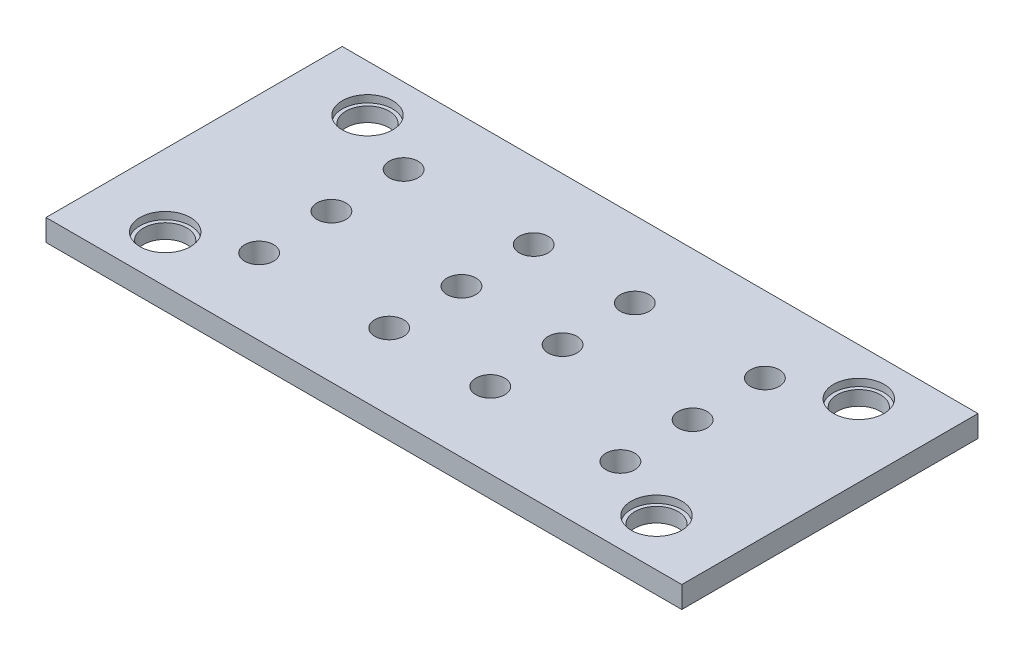
ISO-10303-21;
HEADER;
FILE_DESCRIPTION(('STEP AP214'),'2;1');
FILE_NAME('part.step','',(''),(''),'','','');
FILE_SCHEMA(('AUTOMOTIVE_DESIGN { 1 0 10303 214 1 1 1 1 }'));
ENDSEC;
DATA;
#1=APPLICATION_CONTEXT('core data for automotive mechanical design processes');
#2=APPLICATION_PROTOCOL_DEFINITION('international standard','automotive_design',2000,#1);
#3=PRODUCT_CONTEXT('',#1,'mechanical');
#4=PRODUCT('Part','Part','',(#3));
#5=PRODUCT_RELATED_PRODUCT_CATEGORY('part','',(#4));
#6=PRODUCT_DEFINITION_FORMATION('','',#4);
#7=PRODUCT_DEFINITION_CONTEXT('part definition',#1,'design');
#8=PRODUCT_DEFINITION('design','',#6,#7);
#9=PRODUCT_DEFINITION_SHAPE('','',#8);
#10=(LENGTH_UNIT() NAMED_UNIT(*) SI_UNIT(.MILLI.,.METRE.));
#11=(NAMED_UNIT(*) PLANE_ANGLE_UNIT() SI_UNIT($,.RADIAN.));
#12=(NAMED_UNIT(*) SI_UNIT($,.STERADIAN.) SOLID_ANGLE_UNIT());
#13=UNCERTAINTY_MEASURE_WITH_UNIT(LENGTH_MEASURE(1.E-05),#10,'distance_accuracy_value','');
#14=(GEOMETRIC_REPRESENTATION_CONTEXT(3) GLOBAL_UNCERTAINTY_ASSIGNED_CONTEXT((#13)) GLOBAL_UNIT_ASSIGNED_CONTEXT((#10,
#11,#12)) REPRESENTATION_CONTEXT('',''));
#15=CARTESIAN_POINT('',(0.,0.,0.));
#16=DIRECTION('',(0.,0.,1.));
#17=DIRECTION('',(1.,0.,0.));
#18=AXIS2_PLACEMENT_3D('',#15,#16,#17);
#19=CARTESIAN_POINT('',(340.,-195.,140.));
#20=DIRECTION('',(0.,1.,0.));
#21=DIRECTION('',(0.,0.,1.));
#22=AXIS2_PLACEMENT_3D('',#19,#20,#21);
#23=CYLINDRICAL_SURFACE('',#22,30.);
#24=CARTESIAN_POINT('',(340.,0.,140.));
#25=DIRECTION('',(0.,1.,0.));
#26=DIRECTION('',(0.,0.,1.));
#27=AXIS2_PLACEMENT_3D('',#24,#25,#26);
#28=CIRCLE('',#27,30.);
#29=CARTESIAN_POINT('',(340.,0.,170.));
#30=VERTEX_POINT('',#29);
#31=EDGE_CURVE('E114',#30,#30,#28,.T.);
#32=ORIENTED_EDGE('',*,*,#31,.F.);
#33=EDGE_LOOP('',(#32));
#34=FACE_BOUND('',#33,.T.);
#35=CARTESIAN_POINT('',(340.,20.,140.));
#36=DIRECTION('',(0.,1.,0.));
#37=DIRECTION('',(0.,0.,1.));
#38=AXIS2_PLACEMENT_3D('',#35,#36,#37);
#39=CIRCLE('',#38,30.);
#40=CARTESIAN_POINT('',(340.,20.,170.));
#41=VERTEX_POINT('',#40);
#42=EDGE_CURVE('E134',#41,#41,#39,.F.);
#43=ORIENTED_EDGE('',*,*,#42,.F.);
#44=EDGE_LOOP('',(#43));
#45=FACE_BOUND('',#44,.T.);
#46=ADVANCED_FACE('F33',(#34,#45),#23,.F.);
#47=CARTESIAN_POINT('',(-340.,-195.,140.));
#48=DIRECTION('',(0.,1.,0.));
#49=DIRECTION('',(0.,0.,1.));
#50=AXIS2_PLACEMENT_3D('',#47,#48,#49);
#51=CYLINDRICAL_SURFACE('',#50,30.);
#52=CARTESIAN_POINT('',(-340.,0.,140.));
#53=DIRECTION('',(0.,1.,0.));
#54=DIRECTION('',(0.,0.,1.));
#55=AXIS2_PLACEMENT_3D('',#52,#53,#54);
#56=CIRCLE('',#55,30.);
#57=CARTESIAN_POINT('',(-340.,0.,170.));
#58=VERTEX_POINT('',#57);
#59=EDGE_CURVE('E117',#58,#58,#56,.T.);
#60=ORIENTED_EDGE('',*,*,#59,.F.);
#61=EDGE_LOOP('',(#60));
#62=FACE_BOUND('',#61,.T.);
#63=CARTESIAN_POINT('',(-340.,20.,140.));
#64=DIRECTION('',(0.,1.,0.));
#65=DIRECTION('',(0.,0.,1.));
#66=AXIS2_PLACEMENT_3D('',#63,#64,#65);
#67=CIRCLE('',#66,30.);
#68=CARTESIAN_POINT('',(-340.,20.,170.));
#69=VERTEX_POINT('',#68);
#70=EDGE_CURVE('E129',#69,#69,#67,.F.);
#71=ORIENTED_EDGE('',*,*,#70,.F.);
#72=EDGE_LOOP('',(#71));
#73=FACE_BOUND('',#72,.T.);
#74=ADVANCED_FACE('F249',(#62,#73),#51,.F.);
#75=CARTESIAN_POINT('',(340.,-195.,-140.));
#76=DIRECTION('',(0.,1.,0.));
#77=DIRECTION('',(0.,0.,1.));
#78=AXIS2_PLACEMENT_3D('',#75,#76,#77);
#79=CYLINDRICAL_SURFACE('',#78,30.);
#80=CARTESIAN_POINT('',(340.,0.,-140.));
#81=DIRECTION('',(0.,1.,0.));
#82=DIRECTION('',(0.,0.,1.));
#83=AXIS2_PLACEMENT_3D('',#80,#81,#82);
#84=CIRCLE('',#83,30.);
#85=CARTESIAN_POINT('',(340.,0.,-110.));
#86=VERTEX_POINT('',#85);
#87=EDGE_CURVE('E111',#86,#86,#84,.T.);
#88=ORIENTED_EDGE('',*,*,#87,.F.);
#89=EDGE_LOOP('',(#88));
#90=FACE_BOUND('',#89,.T.);
#91=CARTESIAN_POINT('',(340.,20.,-140.));
#92=DIRECTION('',(0.,1.,0.));
#93=DIRECTION('',(0.,0.,1.));
#94=AXIS2_PLACEMENT_3D('',#91,#92,#93);
#95=CIRCLE('',#94,30.);
#96=CARTESIAN_POINT('',(340.,20.,-110.));
#97=VERTEX_POINT('',#96);
#98=EDGE_CURVE('E124',#97,#97,#95,.F.);
#99=ORIENTED_EDGE('',*,*,#98,.F.);
#100=EDGE_LOOP('',(#99));
#101=FACE_BOUND('',#100,.T.);
#102=ADVANCED_FACE('F256',(#90,#101),#79,.F.);
#103=CARTESIAN_POINT('',(-340.,-195.,-140.));
#104=DIRECTION('',(0.,1.,0.));
#105=DIRECTION('',(0.,0.,1.));
#106=AXIS2_PLACEMENT_3D('',#103,#104,#105);
#107=CYLINDRICAL_SURFACE('',#106,30.);
#108=CARTESIAN_POINT('',(-340.,0.,-140.));
#109=DIRECTION('',(0.,1.,0.));
#110=DIRECTION('',(0.,0.,1.));
#111=AXIS2_PLACEMENT_3D('',#108,#109,#110);
#112=CIRCLE('',#111,30.);
#113=CARTESIAN_POINT('',(-340.,0.,-110.));
#114=VERTEX_POINT('',#113);
#115=EDGE_CURVE('E103',#114,#114,#112,.T.);
#116=ORIENTED_EDGE('',*,*,#115,.F.);
#117=EDGE_LOOP('',(#116));
#118=FACE_BOUND('',#117,.T.);
#119=CARTESIAN_POINT('',(-340.,20.,-140.));
#120=DIRECTION('',(0.,1.,0.));
#121=DIRECTION('',(0.,0.,1.));
#122=AXIS2_PLACEMENT_3D('',#119,#120,#121);
#123=CIRCLE('',#122,30.);
#124=CARTESIAN_POINT('',(-340.,20.,-110.));
#125=VERTEX_POINT('',#124);
#126=EDGE_CURVE('E120',#125,#125,#123,.F.);
#127=ORIENTED_EDGE('',*,*,#126,.F.);
#128=EDGE_LOOP('',(#127));
#129=FACE_BOUND('',#128,.T.);
#130=ADVANCED_FACE('F264',(#118,#129),#107,.F.);
#131=CARTESIAN_POINT('',(440.,30.,-205.));
#132=DIRECTION('',(-1.,0.,0.));
#133=DIRECTION('',(0.,0.,1.));
#134=AXIS2_PLACEMENT_3D('',#131,#132,#133);
#135=PLANE('',#134);
#136=DIRECTION('',(0.,0.,-1.));
#137=VECTOR('',#136,1.);
#138=CARTESIAN_POINT('',(440.,0.,-205.));
#139=LINE('',#138,#137);
#140=CARTESIAN_POINT('',(440.,0.,205.));
#141=VERTEX_POINT('',#140);
#142=CARTESIAN_POINT('',(440.,0.,-205.));
#143=VERTEX_POINT('',#142);
#144=EDGE_CURVE('E100',#141,#143,#139,.T.);
#145=ORIENTED_EDGE('',*,*,#144,.T.);
#146=DIRECTION('',(0.,-1.,0.));
#147=VECTOR('',#146,1.);
#148=CARTESIAN_POINT('',(440.,30.,-205.));
#149=LINE('',#148,#147);
#150=CARTESIAN_POINT('',(440.,30.,-205.));
#151=VERTEX_POINT('',#150);
#152=EDGE_CURVE('E11',#151,#143,#149,.T.);
#153=ORIENTED_EDGE('',*,*,#152,.F.);
#154=DIRECTION('',(0.,0.,-1.));
#155=VECTOR('',#154,1.);
#156=CARTESIAN_POINT('',(440.,30.,-205.));
#157=LINE('',#156,#155);
#158=CARTESIAN_POINT('',(440.,30.,205.));
#159=VERTEX_POINT('',#158);
#160=EDGE_CURVE('E87',#159,#151,#157,.T.);
#161=ORIENTED_EDGE('',*,*,#160,.F.);
#162=DIRECTION('',(0.,-1.,0.));
#163=VECTOR('',#162,1.);
#164=CARTESIAN_POINT('',(440.,30.,205.));
#165=LINE('',#164,#163);
#166=EDGE_CURVE('E96',#159,#141,#165,.T.);
#167=ORIENTED_EDGE('',*,*,#166,.T.);
#168=EDGE_LOOP('',(#145,#153,#161,#167));
#169=FACE_BOUND('',#168,.T.);
#170=ADVANCED_FACE('F35',(#169),#135,.F.);
#171=CARTESIAN_POINT('',(-440.,30.,-205.));
#172=DIRECTION('',(0.,0.,1.));
#173=DIRECTION('',(1.,0.,0.));
#174=AXIS2_PLACEMENT_3D('',#171,#172,#173);
#175=PLANE('',#174);
#176=DIRECTION('',(-1.,0.,0.));
#177=VECTOR('',#176,1.);
#178=CARTESIAN_POINT('',(-440.,0.,-205.));
#179=LINE('',#178,#177);
#180=CARTESIAN_POINT('',(-440.,0.,-205.));
#181=VERTEX_POINT('',#180);
#182=EDGE_CURVE('E91',#143,#181,#179,.T.);
#183=ORIENTED_EDGE('',*,*,#182,.T.);
#184=DIRECTION('',(0.,-1.,0.));
#185=VECTOR('',#184,1.);
#186=CARTESIAN_POINT('',(-440.,30.,-205.));
#187=LINE('',#186,#185);
#188=CARTESIAN_POINT('',(-440.,30.,-205.));
#189=VERTEX_POINT('',#188);
#190=EDGE_CURVE('E43',#189,#181,#187,.T.);
#191=ORIENTED_EDGE('',*,*,#190,.F.);
#192=DIRECTION('',(-1.,0.,0.));
#193=VECTOR('',#192,1.);
#194=CARTESIAN_POINT('',(-440.,30.,-205.));
#195=LINE('',#194,#193);
#196=EDGE_CURVE('E82',#151,#189,#195,.T.);
#197=ORIENTED_EDGE('',*,*,#196,.F.);
#198=ORIENTED_EDGE('',*,*,#152,.T.);
#199=EDGE_LOOP('',(#183,#191,#197,#198));
#200=FACE_BOUND('',#199,.T.);
#201=ADVANCED_FACE('F90',(#200),#175,.F.);
#202=CARTESIAN_POINT('',(-440.,30.,-205.));
#203=DIRECTION('',(1.,0.,0.));
#204=DIRECTION('',(0.,0.,-1.));
#205=AXIS2_PLACEMENT_3D('',#202,#203,#204);
#206=PLANE('',#205);
#207=DIRECTION('',(0.,0.,1.));
#208=VECTOR('',#207,1.);
#209=CARTESIAN_POINT('',(-440.,0.,-205.));
#210=LINE('',#209,#208);
#211=CARTESIAN_POINT('',(-440.,0.,205.));
#212=VERTEX_POINT('',#211);
#213=EDGE_CURVE('E69',#181,#212,#210,.T.);
#214=ORIENTED_EDGE('',*,*,#213,.T.);
#215=DIRECTION('',(0.,-1.,0.));
#216=VECTOR('',#215,1.);
#217=CARTESIAN_POINT('',(-440.,30.,205.));
#218=LINE('',#217,#216);
#219=CARTESIAN_POINT('',(-440.,30.,205.));
#220=VERTEX_POINT('',#219);
#221=EDGE_CURVE('E92',#220,#212,#218,.T.);
#222=ORIENTED_EDGE('',*,*,#221,.F.);
#223=DIRECTION('',(0.,0.,1.));
#224=VECTOR('',#223,1.);
#225=CARTESIAN_POINT('',(-440.,30.,-205.));
#226=LINE('',#225,#224);
#227=EDGE_CURVE('E85',#189,#220,#226,.T.);
#228=ORIENTED_EDGE('',*,*,#227,.F.);
#229=ORIENTED_EDGE('',*,*,#190,.T.);
#230=EDGE_LOOP('',(#214,#222,#228,#229));
#231=FACE_BOUND('',#230,.T.);
#232=ADVANCED_FACE('F94',(#231),#206,.F.);
#233=CARTESIAN_POINT('',(-440.,30.,205.));
#234=DIRECTION('',(0.,0.,-1.));
#235=DIRECTION('',(-1.,0.,0.));
#236=AXIS2_PLACEMENT_3D('',#233,#234,#235);
#237=PLANE('',#236);
#238=DIRECTION('',(1.,0.,0.));
#239=VECTOR('',#238,1.);
#240=CARTESIAN_POINT('',(-440.,0.,205.));
#241=LINE('',#240,#239);
#242=EDGE_CURVE('E75',#212,#141,#241,.T.);
#243=ORIENTED_EDGE('',*,*,#242,.T.);
#244=ORIENTED_EDGE('',*,*,#166,.F.);
#245=DIRECTION('',(1.,0.,0.));
#246=VECTOR('',#245,1.);
#247=CARTESIAN_POINT('',(-440.,30.,205.));
#248=LINE('',#247,#246);
#249=EDGE_CURVE('E52',#220,#159,#248,.T.);
#250=ORIENTED_EDGE('',*,*,#249,.F.);
#251=ORIENTED_EDGE('',*,*,#221,.T.);
#252=EDGE_LOOP('',(#243,#244,#250,#251));
#253=FACE_BOUND('',#252,.T.);
#254=ADVANCED_FACE('F233',(#253),#237,.F.);
#255=CARTESIAN_POINT('',(0.,30.,0.));
#256=DIRECTION('',(0.,1.,0.));
#257=DIRECTION('',(0.,0.,1.));
#258=AXIS2_PLACEMENT_3D('',#255,#256,#257);
#259=PLANE('',#258);
#260=CARTESIAN_POINT('',(250.,30.,0.));
#261=DIRECTION('',(0.,1.,0.));
#262=DIRECTION('',(0.,0.,-1.));
#263=AXIS2_PLACEMENT_3D('',#260,#261,#262);
#264=CIRCLE('',#263,20.);
#265=CARTESIAN_POINT('',(250.,30.,-20.));
#266=VERTEX_POINT('',#265);
#267=EDGE_CURVE('E191',#266,#266,#264,.T.);
#268=ORIENTED_EDGE('',*,*,#267,.F.);
#269=EDGE_LOOP('',(#268));
#270=FACE_BOUND('',#269,.T.);
#271=CARTESIAN_POINT('',(70.,30.,0.));
#272=DIRECTION('',(0.,1.,0.));
#273=DIRECTION('',(0.,0.,-1.));
#274=AXIS2_PLACEMENT_3D('',#271,#272,#273);
#275=CIRCLE('',#274,20.);
#276=CARTESIAN_POINT('',(70.,30.,-20.));
#277=VERTEX_POINT('',#276);
#278=EDGE_CURVE('E181',#277,#277,#275,.T.);
#279=ORIENTED_EDGE('',*,*,#278,.F.);
#280=EDGE_LOOP('',(#279));
#281=FACE_BOUND('',#280,.T.);
#282=CARTESIAN_POINT('',(250.,30.,-99.9999999999999));
#283=DIRECTION('',(0.,1.,0.));
#284=DIRECTION('',(0.,0.,-1.));
#285=AXIS2_PLACEMENT_3D('',#282,#283,#284);
#286=CIRCLE('',#285,20.);
#287=CARTESIAN_POINT('',(250.,30.,-120.));
#288=VERTEX_POINT('',#287);
#289=EDGE_CURVE('E178',#288,#288,#286,.T.);
#290=ORIENTED_EDGE('',*,*,#289,.F.);
#291=EDGE_LOOP('',(#290));
#292=FACE_BOUND('',#291,.T.);
#293=CARTESIAN_POINT('',(250.,30.,99.9999999999999));
#294=DIRECTION('',(0.,1.,0.));
#295=DIRECTION('',(0.,0.,-1.));
#296=AXIS2_PLACEMENT_3D('',#293,#294,#295);
#297=CIRCLE('',#296,20.);
#298=CARTESIAN_POINT('',(250.,30.,79.9999999999999));
#299=VERTEX_POINT('',#298);
#300=EDGE_CURVE('E175',#299,#299,#297,.T.);
#301=ORIENTED_EDGE('',*,*,#300,.F.);
#302=EDGE_LOOP('',(#301));
#303=FACE_BOUND('',#302,.T.);
#304=CARTESIAN_POINT('',(70.,30.,-99.9999999999999));
#305=DIRECTION('',(0.,1.,0.));
#306=DIRECTION('',(0.,0.,-1.));
#307=AXIS2_PLACEMENT_3D('',#304,#305,#306);
#308=CIRCLE('',#307,20.);
#309=CARTESIAN_POINT('',(70.,30.,-120.));
#310=VERTEX_POINT('',#309);
#311=EDGE_CURVE('E171',#310,#310,#308,.T.);
#312=ORIENTED_EDGE('',*,*,#311,.F.);
#313=EDGE_LOOP('',(#312));
#314=FACE_BOUND('',#313,.T.);
#315=CARTESIAN_POINT('',(70.,30.,99.9999999999999));
#316=DIRECTION('',(0.,1.,0.));
#317=DIRECTION('',(0.,0.,-1.));
#318=AXIS2_PLACEMENT_3D('',#315,#316,#317);
#319=CIRCLE('',#318,20.);
#320=CARTESIAN_POINT('',(70.,30.,79.9999999999999));
#321=VERTEX_POINT('',#320);
#322=EDGE_CURVE('E167',#321,#321,#319,.T.);
#323=ORIENTED_EDGE('',*,*,#322,.F.);
#324=EDGE_LOOP('',(#323));
#325=FACE_BOUND('',#324,.T.);
#326=CARTESIAN_POINT('',(-70.,30.,100.));
#327=DIRECTION('',(0.,1.,0.));
#328=DIRECTION('',(0.,0.,1.));
#329=AXIS2_PLACEMENT_3D('',#326,#327,#328);
#330=CIRCLE('',#329,20.);
#331=CARTESIAN_POINT('',(-70.,30.,120.));
#332=VERTEX_POINT('',#331);
#333=EDGE_CURVE('E163',#332,#332,#330,.T.);
#334=ORIENTED_EDGE('',*,*,#333,.F.);
#335=EDGE_LOOP('',(#334));
#336=FACE_BOUND('',#335,.T.);
#337=CARTESIAN_POINT('',(-70.,30.,-100.));
#338=DIRECTION('',(0.,1.,0.));
#339=DIRECTION('',(0.,0.,1.));
#340=AXIS2_PLACEMENT_3D('',#337,#338,#339);
#341=CIRCLE('',#340,20.);
#342=CARTESIAN_POINT('',(-70.,30.,-80.));
#343=VERTEX_POINT('',#342);
#344=EDGE_CURVE('E159',#343,#343,#341,.T.);
#345=ORIENTED_EDGE('',*,*,#344,.F.);
#346=EDGE_LOOP('',(#345));
#347=FACE_BOUND('',#346,.T.);
#348=CARTESIAN_POINT('',(-250.,30.,100.));
#349=DIRECTION('',(0.,1.,0.));
#350=DIRECTION('',(0.,0.,1.));
#351=AXIS2_PLACEMENT_3D('',#348,#349,#350);
#352=CIRCLE('',#351,20.);
#353=CARTESIAN_POINT('',(-250.,30.,120.));
#354=VERTEX_POINT('',#353);
#355=EDGE_CURVE('E155',#354,#354,#352,.T.);
#356=ORIENTED_EDGE('',*,*,#355,.F.);
#357=EDGE_LOOP('',(#356));
#358=FACE_BOUND('',#357,.T.);
#359=CARTESIAN_POINT('',(-250.,30.,-100.));
#360=DIRECTION('',(0.,1.,0.));
#361=DIRECTION('',(0.,0.,1.));
#362=AXIS2_PLACEMENT_3D('',#359,#360,#361);
#363=CIRCLE('',#362,20.);
#364=CARTESIAN_POINT('',(-250.,30.,-80.));
#365=VERTEX_POINT('',#364);
#366=EDGE_CURVE('E151',#365,#365,#363,.T.);
#367=ORIENTED_EDGE('',*,*,#366,.F.);
#368=EDGE_LOOP('',(#367));
#369=FACE_BOUND('',#368,.T.);
#370=CARTESIAN_POINT('',(-70.,30.,0.));
#371=DIRECTION('',(0.,1.,0.));
#372=DIRECTION('',(0.,0.,1.));
#373=AXIS2_PLACEMENT_3D('',#370,#371,#372);
#374=CIRCLE('',#373,20.);
#375=CARTESIAN_POINT('',(-70.,30.,20.));
#376=VERTEX_POINT('',#375);
#377=EDGE_CURVE('E147',#376,#376,#374,.T.);
#378=ORIENTED_EDGE('',*,*,#377,.F.);
#379=EDGE_LOOP('',(#378));
#380=FACE_BOUND('',#379,.T.);
#381=CARTESIAN_POINT('',(-250.,30.,0.));
#382=DIRECTION('',(0.,1.,0.));
#383=DIRECTION('',(0.,0.,1.));
#384=AXIS2_PLACEMENT_3D('',#381,#382,#383);
#385=CIRCLE('',#384,20.);
#386=CARTESIAN_POINT('',(-250.,30.,20.));
#387=VERTEX_POINT('',#386);
#388=EDGE_CURVE('E143',#387,#387,#385,.T.);
#389=ORIENTED_EDGE('',*,*,#388,.F.);
#390=EDGE_LOOP('',(#389));
#391=FACE_BOUND('',#390,.T.);
#392=CARTESIAN_POINT('',(340.000000000003,30.,140.));
#393=DIRECTION('',(0.,1.,0.));
#394=DIRECTION('',(0.,0.,1.));
#395=AXIS2_PLACEMENT_3D('',#392,#393,#394);
#396=CIRCLE('',#395,35.);
#397=CARTESIAN_POINT('',(340.000000000003,30.,175.));
#398=VERTEX_POINT('',#397);
#399=EDGE_CURVE('E142',#398,#398,#396,.T.);
#400=ORIENTED_EDGE('',*,*,#399,.F.);
#401=EDGE_LOOP('',(#400));
#402=FACE_BOUND('',#401,.T.);
#403=CARTESIAN_POINT('',(-339.999999999997,30.,140.));
#404=DIRECTION('',(0.,1.,0.));
#405=DIRECTION('',(0.,0.,1.));
#406=AXIS2_PLACEMENT_3D('',#403,#404,#405);
#407=CIRCLE('',#406,35.);
#408=CARTESIAN_POINT('',(-339.999999999997,30.,175.));
#409=VERTEX_POINT('',#408);
#410=EDGE_CURVE('E137',#409,#409,#407,.T.);
#411=ORIENTED_EDGE('',*,*,#410,.F.);
#412=EDGE_LOOP('',(#411));
#413=FACE_BOUND('',#412,.T.);
#414=CARTESIAN_POINT('',(340.,30.,-140.));
#415=DIRECTION('',(0.,1.,0.));
#416=DIRECTION('',(0.,0.,1.));
#417=AXIS2_PLACEMENT_3D('',#414,#415,#416);
#418=CIRCLE('',#417,35.);
#419=CARTESIAN_POINT('',(340.,30.,-105.));
#420=VERTEX_POINT('',#419);
#421=EDGE_CURVE('E132',#420,#420,#418,.T.);
#422=ORIENTED_EDGE('',*,*,#421,.F.);
#423=EDGE_LOOP('',(#422));
#424=FACE_BOUND('',#423,.T.);
#425=CARTESIAN_POINT('',(-340.,30.,-140.));
#426=DIRECTION('',(0.,1.,0.));
#427=DIRECTION('',(0.,0.,1.));
#428=AXIS2_PLACEMENT_3D('',#425,#426,#427);
#429=CIRCLE('',#428,35.);
#430=CARTESIAN_POINT('',(-340.,30.,-105.));
#431=VERTEX_POINT('',#430);
#432=EDGE_CURVE('E127',#431,#431,#429,.T.);
#433=ORIENTED_EDGE('',*,*,#432,.F.);
#434=EDGE_LOOP('',(#433));
#435=FACE_BOUND('',#434,.T.);
#436=ORIENTED_EDGE('',*,*,#160,.T.);
#437=ORIENTED_EDGE('',*,*,#196,.T.);
#438=ORIENTED_EDGE('',*,*,#227,.T.);
#439=ORIENTED_EDGE('',*,*,#249,.T.);
#440=EDGE_LOOP('',(#436,#437,#438,#439));
#441=FACE_BOUND('',#440,.T.);
#442=ADVANCED_FACE('F83',(#270,#281,#292,#303,#314,#325,#336,#347,#358,#369,#380,#391,#402,#413,
#424,#435,#441),#259,.T.);
#443=CARTESIAN_POINT('',(0.,0.,0.));
#444=DIRECTION('',(0.,1.,0.));
#445=DIRECTION('',(0.,0.,1.));
#446=AXIS2_PLACEMENT_3D('',#443,#444,#445);
#447=PLANE('',#446);
#448=CARTESIAN_POINT('',(250.,0.,0.));
#449=DIRECTION('',(0.,1.,0.));
#450=DIRECTION('',(0.,0.,1.));
#451=AXIS2_PLACEMENT_3D('',#448,#449,#450);
#452=CIRCLE('',#451,20.);
#453=CARTESIAN_POINT('',(250.,0.,20.));
#454=VERTEX_POINT('',#453);
#455=EDGE_CURVE('E37',#454,#454,#452,.T.);
#456=ORIENTED_EDGE('',*,*,#455,.T.);
#457=EDGE_LOOP('',(#456));
#458=FACE_BOUND('',#457,.T.);
#459=CARTESIAN_POINT('',(70.,0.,0.));
#460=DIRECTION('',(0.,1.,0.));
#461=DIRECTION('',(0.,0.,1.));
#462=AXIS2_PLACEMENT_3D('',#459,#460,#461);
#463=CIRCLE('',#462,20.);
#464=CARTESIAN_POINT('',(70.,0.,20.));
#465=VERTEX_POINT('',#464);
#466=EDGE_CURVE('E179',#465,#465,#463,.T.);
#467=ORIENTED_EDGE('',*,*,#466,.T.);
#468=EDGE_LOOP('',(#467));
#469=FACE_BOUND('',#468,.T.);
#470=CARTESIAN_POINT('',(250.,0.,-99.9999999999999));
#471=DIRECTION('',(0.,1.,0.));
#472=DIRECTION('',(0.,0.,1.));
#473=AXIS2_PLACEMENT_3D('',#470,#471,#472);
#474=CIRCLE('',#473,20.);
#475=CARTESIAN_POINT('',(250.,0.,-80.));
#476=VERTEX_POINT('',#475);
#477=EDGE_CURVE('E176',#476,#476,#474,.T.);
#478=ORIENTED_EDGE('',*,*,#477,.T.);
#479=EDGE_LOOP('',(#478));
#480=FACE_BOUND('',#479,.T.);
#481=CARTESIAN_POINT('',(250.,0.,99.9999999999999));
#482=DIRECTION('',(0.,1.,0.));
#483=DIRECTION('',(0.,0.,1.));
#484=AXIS2_PLACEMENT_3D('',#481,#482,#483);
#485=CIRCLE('',#484,20.);
#486=CARTESIAN_POINT('',(250.,0.,120.));
#487=VERTEX_POINT('',#486);
#488=EDGE_CURVE('E172',#487,#487,#485,.T.);
#489=ORIENTED_EDGE('',*,*,#488,.T.);
#490=EDGE_LOOP('',(#489));
#491=FACE_BOUND('',#490,.T.);
#492=CARTESIAN_POINT('',(70.,0.,-99.9999999999999));
#493=DIRECTION('',(0.,1.,0.));
#494=DIRECTION('',(0.,0.,1.));
#495=AXIS2_PLACEMENT_3D('',#492,#493,#494);
#496=CIRCLE('',#495,20.);
#497=CARTESIAN_POINT('',(70.,0.,-79.9999999999999));
#498=VERTEX_POINT('',#497);
#499=EDGE_CURVE('E168',#498,#498,#496,.T.);
#500=ORIENTED_EDGE('',*,*,#499,.T.);
#501=EDGE_LOOP('',(#500));
#502=FACE_BOUND('',#501,.T.);
#503=CARTESIAN_POINT('',(70.,0.,99.9999999999999));
#504=DIRECTION('',(0.,1.,0.));
#505=DIRECTION('',(0.,0.,1.));
#506=AXIS2_PLACEMENT_3D('',#503,#504,#505);
#507=CIRCLE('',#506,20.);
#508=CARTESIAN_POINT('',(70.,0.,120.));
#509=VERTEX_POINT('',#508);
#510=EDGE_CURVE('E164',#509,#509,#507,.T.);
#511=ORIENTED_EDGE('',*,*,#510,.T.);
#512=EDGE_LOOP('',(#511));
#513=FACE_BOUND('',#512,.T.);
#514=CARTESIAN_POINT('',(-70.,0.,100.));
#515=DIRECTION('',(0.,1.,0.));
#516=DIRECTION('',(0.,0.,1.));
#517=AXIS2_PLACEMENT_3D('',#514,#515,#516);
#518=CIRCLE('',#517,20.);
#519=CARTESIAN_POINT('',(-70.,0.,120.));
#520=VERTEX_POINT('',#519);
#521=EDGE_CURVE('E160',#520,#520,#518,.T.);
#522=ORIENTED_EDGE('',*,*,#521,.T.);
#523=EDGE_LOOP('',(#522));
#524=FACE_BOUND('',#523,.T.);
#525=CARTESIAN_POINT('',(-70.,0.,-100.));
#526=DIRECTION('',(0.,1.,0.));
#527=DIRECTION('',(0.,0.,1.));
#528=AXIS2_PLACEMENT_3D('',#525,#526,#527);
#529=CIRCLE('',#528,20.);
#530=CARTESIAN_POINT('',(-70.,0.,-80.));
#531=VERTEX_POINT('',#530);
#532=EDGE_CURVE('E156',#531,#531,#529,.T.);
#533=ORIENTED_EDGE('',*,*,#532,.T.);
#534=EDGE_LOOP('',(#533));
#535=FACE_BOUND('',#534,.T.);
#536=CARTESIAN_POINT('',(-250.,0.,100.));
#537=DIRECTION('',(0.,1.,0.));
#538=DIRECTION('',(0.,0.,1.));
#539=AXIS2_PLACEMENT_3D('',#536,#537,#538);
#540=CIRCLE('',#539,20.);
#541=CARTESIAN_POINT('',(-250.,0.,120.));
#542=VERTEX_POINT('',#541);
#543=EDGE_CURVE('E152',#542,#542,#540,.T.);
#544=ORIENTED_EDGE('',*,*,#543,.T.);
#545=EDGE_LOOP('',(#544));
#546=FACE_BOUND('',#545,.T.);
#547=CARTESIAN_POINT('',(-250.,0.,-100.));
#548=DIRECTION('',(0.,1.,0.));
#549=DIRECTION('',(0.,0.,1.));
#550=AXIS2_PLACEMENT_3D('',#547,#548,#549);
#551=CIRCLE('',#550,20.);
#552=CARTESIAN_POINT('',(-250.,0.,-80.));
#553=VERTEX_POINT('',#552);
#554=EDGE_CURVE('E148',#553,#553,#551,.T.);
#555=ORIENTED_EDGE('',*,*,#554,.T.);
#556=EDGE_LOOP('',(#555));
#557=FACE_BOUND('',#556,.T.);
#558=CARTESIAN_POINT('',(-70.,0.,0.));
#559=DIRECTION('',(0.,1.,0.));
#560=DIRECTION('',(0.,0.,1.));
#561=AXIS2_PLACEMENT_3D('',#558,#559,#560);
#562=CIRCLE('',#561,20.);
#563=CARTESIAN_POINT('',(-70.,0.,20.));
#564=VERTEX_POINT('',#563);
#565=EDGE_CURVE('E144',#564,#564,#562,.T.);
#566=ORIENTED_EDGE('',*,*,#565,.T.);
#567=EDGE_LOOP('',(#566));
#568=FACE_BOUND('',#567,.T.);
#569=CARTESIAN_POINT('',(-250.,0.,0.));
#570=DIRECTION('',(0.,1.,0.));
#571=DIRECTION('',(0.,0.,1.));
#572=AXIS2_PLACEMENT_3D('',#569,#570,#571);
#573=CIRCLE('',#572,20.);
#574=CARTESIAN_POINT('',(-250.,0.,20.));
#575=VERTEX_POINT('',#574);
#576=EDGE_CURVE('E139',#575,#575,#573,.T.);
#577=ORIENTED_EDGE('',*,*,#576,.T.);
#578=EDGE_LOOP('',(#577));
#579=FACE_BOUND('',#578,.T.);
#580=ORIENTED_EDGE('',*,*,#59,.T.);
#581=EDGE_LOOP('',(#580));
#582=FACE_BOUND('',#581,.T.);
#583=ORIENTED_EDGE('',*,*,#31,.T.);
#584=EDGE_LOOP('',(#583));
#585=FACE_BOUND('',#584,.T.);
#586=ORIENTED_EDGE('',*,*,#87,.T.);
#587=EDGE_LOOP('',(#586));
#588=FACE_BOUND('',#587,.T.);
#589=ORIENTED_EDGE('',*,*,#115,.T.);
#590=EDGE_LOOP('',(#589));
#591=FACE_BOUND('',#590,.T.);
#592=ORIENTED_EDGE('',*,*,#144,.F.);
#593=ORIENTED_EDGE('',*,*,#242,.F.);
#594=ORIENTED_EDGE('',*,*,#213,.F.);
#595=ORIENTED_EDGE('',*,*,#182,.F.);
#596=EDGE_LOOP('',(#592,#593,#594,#595));
#597=FACE_BOUND('',#596,.T.);
#598=ADVANCED_FACE('F232',(#458,#469,#480,#491,#502,#513,#524,#535,#546,#557,#568,#579,#582,
#585,#588,#591,#597),#447,.F.);
#599=CARTESIAN_POINT('',(-340.,20.,-140.));
#600=DIRECTION('',(0.,1.,0.));
#601=DIRECTION('',(0.,0.,1.));
#602=AXIS2_PLACEMENT_3D('',#599,#600,#601);
#603=PLANE('',#602);
#604=CARTESIAN_POINT('',(-340.,20.,-140.));
#605=DIRECTION('',(0.,1.,0.));
#606=DIRECTION('',(0.,0.,1.));
#607=AXIS2_PLACEMENT_3D('',#604,#605,#606);
#608=CIRCLE('',#607,35.);
#609=CARTESIAN_POINT('',(-340.,20.,-105.));
#610=VERTEX_POINT('',#609);
#611=EDGE_CURVE('E123',#610,#610,#608,.T.);
#612=ORIENTED_EDGE('',*,*,#611,.T.);
#613=EDGE_LOOP('',(#612));
#614=FACE_BOUND('',#613,.T.);
#615=ORIENTED_EDGE('',*,*,#126,.T.);
#616=EDGE_LOOP('',(#615));
#617=FACE_BOUND('',#616,.T.);
#618=ADVANCED_FACE('F240',(#614,#617),#603,.T.);
#619=CARTESIAN_POINT('',(-340.,20.,-140.));
#620=DIRECTION('',(0.,1.,0.));
#621=DIRECTION('',(0.,0.,1.));
#622=AXIS2_PLACEMENT_3D('',#619,#620,#621);
#623=CYLINDRICAL_SURFACE('',#622,35.);
#624=ORIENTED_EDGE('',*,*,#611,.F.);
#625=EDGE_LOOP('',(#624));
#626=FACE_BOUND('',#625,.T.);
#627=ORIENTED_EDGE('',*,*,#432,.T.);
#628=EDGE_LOOP('',(#627));
#629=FACE_BOUND('',#628,.T.);
#630=ADVANCED_FACE('F229',(#626,#629),#623,.F.);
#631=CARTESIAN_POINT('',(340.,20.,-140.));
#632=DIRECTION('',(0.,1.,0.));
#633=DIRECTION('',(0.,0.,1.));
#634=AXIS2_PLACEMENT_3D('',#631,#632,#633);
#635=PLANE('',#634);
#636=CARTESIAN_POINT('',(340.,20.,-140.));
#637=DIRECTION('',(0.,1.,0.));
#638=DIRECTION('',(0.,0.,1.));
#639=AXIS2_PLACEMENT_3D('',#636,#637,#638);
#640=CIRCLE('',#639,35.);
#641=CARTESIAN_POINT('',(340.,20.,-105.));
#642=VERTEX_POINT('',#641);
#643=EDGE_CURVE('E128',#642,#642,#640,.T.);
#644=ORIENTED_EDGE('',*,*,#643,.T.);
#645=EDGE_LOOP('',(#644));
#646=FACE_BOUND('',#645,.T.);
#647=ORIENTED_EDGE('',*,*,#98,.T.);
#648=EDGE_LOOP('',(#647));
#649=FACE_BOUND('',#648,.T.);
#650=ADVANCED_FACE('F282',(#646,#649),#635,.T.);
#651=CARTESIAN_POINT('',(340.,20.,-140.));
#652=DIRECTION('',(0.,1.,0.));
#653=DIRECTION('',(0.,0.,1.));
#654=AXIS2_PLACEMENT_3D('',#651,#652,#653);
#655=CYLINDRICAL_SURFACE('',#654,35.);
#656=ORIENTED_EDGE('',*,*,#643,.F.);
#657=EDGE_LOOP('',(#656));
#658=FACE_BOUND('',#657,.T.);
#659=ORIENTED_EDGE('',*,*,#421,.T.);
#660=EDGE_LOOP('',(#659));
#661=FACE_BOUND('',#660,.T.);
#662=ADVANCED_FACE('F285',(#658,#661),#655,.F.);
#663=CARTESIAN_POINT('',(-339.999999999997,20.,140.));
#664=DIRECTION('',(0.,1.,0.));
#665=DIRECTION('',(0.,0.,1.));
#666=AXIS2_PLACEMENT_3D('',#663,#664,#665);
#667=PLANE('',#666);
#668=CARTESIAN_POINT('',(-339.999999999997,20.,140.));
#669=DIRECTION('',(0.,1.,0.));
#670=DIRECTION('',(0.,0.,1.));
#671=AXIS2_PLACEMENT_3D('',#668,#669,#670);
#672=CIRCLE('',#671,35.);
#673=CARTESIAN_POINT('',(-339.999999999997,20.,175.));
#674=VERTEX_POINT('',#673);
#675=EDGE_CURVE('E133',#674,#674,#672,.T.);
#676=ORIENTED_EDGE('',*,*,#675,.T.);
#677=EDGE_LOOP('',(#676));
#678=FACE_BOUND('',#677,.T.);
#679=ORIENTED_EDGE('',*,*,#70,.T.);
#680=EDGE_LOOP('',(#679));
#681=FACE_BOUND('',#680,.T.);
#682=ADVANCED_FACE('F288',(#678,#681),#667,.T.);
#683=CARTESIAN_POINT('',(-339.999999999997,20.,140.));
#684=DIRECTION('',(0.,1.,0.));
#685=DIRECTION('',(0.,0.,1.));
#686=AXIS2_PLACEMENT_3D('',#683,#684,#685);
#687=CYLINDRICAL_SURFACE('',#686,35.);
#688=ORIENTED_EDGE('',*,*,#675,.F.);
#689=EDGE_LOOP('',(#688));
#690=FACE_BOUND('',#689,.T.);
#691=ORIENTED_EDGE('',*,*,#410,.T.);
#692=EDGE_LOOP('',(#691));
#693=FACE_BOUND('',#692,.T.);
#694=ADVANCED_FACE('F293',(#690,#693),#687,.F.);
#695=CARTESIAN_POINT('',(340.000000000003,20.,140.));
#696=DIRECTION('',(0.,1.,0.));
#697=DIRECTION('',(0.,0.,1.));
#698=AXIS2_PLACEMENT_3D('',#695,#696,#697);
#699=PLANE('',#698);
#700=CARTESIAN_POINT('',(340.000000000003,20.,140.));
#701=DIRECTION('',(0.,1.,0.));
#702=DIRECTION('',(0.,0.,1.));
#703=AXIS2_PLACEMENT_3D('',#700,#701,#702);
#704=CIRCLE('',#703,35.);
#705=CARTESIAN_POINT('',(340.000000000003,20.,175.));
#706=VERTEX_POINT('',#705);
#707=EDGE_CURVE('E138',#706,#706,#704,.T.);
#708=ORIENTED_EDGE('',*,*,#707,.T.);
#709=EDGE_LOOP('',(#708));
#710=FACE_BOUND('',#709,.T.);
#711=ORIENTED_EDGE('',*,*,#42,.T.);
#712=EDGE_LOOP('',(#711));
#713=FACE_BOUND('',#712,.T.);
#714=ADVANCED_FACE('F296',(#710,#713),#699,.T.);
#715=CARTESIAN_POINT('',(340.000000000003,20.,140.));
#716=DIRECTION('',(0.,1.,0.));
#717=DIRECTION('',(0.,0.,1.));
#718=AXIS2_PLACEMENT_3D('',#715,#716,#717);
#719=CYLINDRICAL_SURFACE('',#718,35.);
#720=ORIENTED_EDGE('',*,*,#707,.F.);
#721=EDGE_LOOP('',(#720));
#722=FACE_BOUND('',#721,.T.);
#723=ORIENTED_EDGE('',*,*,#399,.T.);
#724=EDGE_LOOP('',(#723));
#725=FACE_BOUND('',#724,.T.);
#726=ADVANCED_FACE('F301',(#722,#725),#719,.F.);
#727=CARTESIAN_POINT('',(-250.,-124.,0.));
#728=DIRECTION('',(0.,1.,0.));
#729=DIRECTION('',(0.,0.,1.));
#730=AXIS2_PLACEMENT_3D('',#727,#728,#729);
#731=CYLINDRICAL_SURFACE('',#730,20.);
#732=ORIENTED_EDGE('',*,*,#388,.T.);
#733=EDGE_LOOP('',(#732));
#734=FACE_BOUND('',#733,.T.);
#735=ORIENTED_EDGE('',*,*,#576,.F.);
#736=EDGE_LOOP('',(#735));
#737=FACE_BOUND('',#736,.T.);
#738=ADVANCED_FACE('F304',(#734,#737),#731,.F.);
#739=CARTESIAN_POINT('',(-70.,-124.,0.));
#740=DIRECTION('',(0.,1.,0.));
#741=DIRECTION('',(0.,0.,1.));
#742=AXIS2_PLACEMENT_3D('',#739,#740,#741);
#743=CYLINDRICAL_SURFACE('',#742,20.);
#744=ORIENTED_EDGE('',*,*,#377,.T.);
#745=EDGE_LOOP('',(#744));
#746=FACE_BOUND('',#745,.T.);
#747=ORIENTED_EDGE('',*,*,#565,.F.);
#748=EDGE_LOOP('',(#747));
#749=FACE_BOUND('',#748,.T.);
#750=ADVANCED_FACE('F311',(#746,#749),#743,.F.);
#751=CARTESIAN_POINT('',(-250.,-124.,-100.));
#752=DIRECTION('',(0.,1.,0.));
#753=DIRECTION('',(0.,0.,1.));
#754=AXIS2_PLACEMENT_3D('',#751,#752,#753);
#755=CYLINDRICAL_SURFACE('',#754,20.);
#756=ORIENTED_EDGE('',*,*,#366,.T.);
#757=EDGE_LOOP('',(#756));
#758=FACE_BOUND('',#757,.T.);
#759=ORIENTED_EDGE('',*,*,#554,.F.);
#760=EDGE_LOOP('',(#759));
#761=FACE_BOUND('',#760,.T.);
#762=ADVANCED_FACE('F315',(#758,#761),#755,.F.);
#763=CARTESIAN_POINT('',(-250.,-124.,100.));
#764=DIRECTION('',(0.,1.,0.));
#765=DIRECTION('',(0.,0.,1.));
#766=AXIS2_PLACEMENT_3D('',#763,#764,#765);
#767=CYLINDRICAL_SURFACE('',#766,20.);
#768=ORIENTED_EDGE('',*,*,#355,.T.);
#769=EDGE_LOOP('',(#768));
#770=FACE_BOUND('',#769,.T.);
#771=ORIENTED_EDGE('',*,*,#543,.F.);
#772=EDGE_LOOP('',(#771));
#773=FACE_BOUND('',#772,.T.);
#774=ADVANCED_FACE('F319',(#770,#773),#767,.F.);
#775=CARTESIAN_POINT('',(-70.,-124.,-100.));
#776=DIRECTION('',(0.,1.,0.));
#777=DIRECTION('',(0.,0.,1.));
#778=AXIS2_PLACEMENT_3D('',#775,#776,#777);
#779=CYLINDRICAL_SURFACE('',#778,20.);
#780=ORIENTED_EDGE('',*,*,#344,.T.);
#781=EDGE_LOOP('',(#780));
#782=FACE_BOUND('',#781,.T.);
#783=ORIENTED_EDGE('',*,*,#532,.F.);
#784=EDGE_LOOP('',(#783));
#785=FACE_BOUND('',#784,.T.);
#786=ADVANCED_FACE('F323',(#782,#785),#779,.F.);
#787=CARTESIAN_POINT('',(-70.,-124.,100.));
#788=DIRECTION('',(0.,1.,0.));
#789=DIRECTION('',(0.,0.,1.));
#790=AXIS2_PLACEMENT_3D('',#787,#788,#789);
#791=CYLINDRICAL_SURFACE('',#790,20.);
#792=ORIENTED_EDGE('',*,*,#333,.T.);
#793=EDGE_LOOP('',(#792));
#794=FACE_BOUND('',#793,.T.);
#795=ORIENTED_EDGE('',*,*,#521,.F.);
#796=EDGE_LOOP('',(#795));
#797=FACE_BOUND('',#796,.T.);
#798=ADVANCED_FACE('F327',(#794,#797),#791,.F.);
#799=CARTESIAN_POINT('',(70.,-124.,99.9999999999999));
#800=DIRECTION('',(0.,1.,0.));
#801=DIRECTION('',(0.,0.,1.));
#802=AXIS2_PLACEMENT_3D('',#799,#800,#801);
#803=CYLINDRICAL_SURFACE('',#802,20.);
#804=ORIENTED_EDGE('',*,*,#322,.T.);
#805=EDGE_LOOP('',(#804));
#806=FACE_BOUND('',#805,.T.);
#807=ORIENTED_EDGE('',*,*,#510,.F.);
#808=EDGE_LOOP('',(#807));
#809=FACE_BOUND('',#808,.T.);
#810=ADVANCED_FACE('F331',(#806,#809),#803,.F.);
#811=CARTESIAN_POINT('',(70.,-124.,-99.9999999999999));
#812=DIRECTION('',(0.,1.,0.));
#813=DIRECTION('',(0.,0.,1.));
#814=AXIS2_PLACEMENT_3D('',#811,#812,#813);
#815=CYLINDRICAL_SURFACE('',#814,20.);
#816=ORIENTED_EDGE('',*,*,#311,.T.);
#817=EDGE_LOOP('',(#816));
#818=FACE_BOUND('',#817,.T.);
#819=ORIENTED_EDGE('',*,*,#499,.F.);
#820=EDGE_LOOP('',(#819));
#821=FACE_BOUND('',#820,.T.);
#822=ADVANCED_FACE('F335',(#818,#821),#815,.F.);
#823=CARTESIAN_POINT('',(250.,-124.,99.9999999999999));
#824=DIRECTION('',(0.,1.,0.));
#825=DIRECTION('',(0.,0.,1.));
#826=AXIS2_PLACEMENT_3D('',#823,#824,#825);
#827=CYLINDRICAL_SURFACE('',#826,20.);
#828=ORIENTED_EDGE('',*,*,#300,.T.);
#829=EDGE_LOOP('',(#828));
#830=FACE_BOUND('',#829,.T.);
#831=ORIENTED_EDGE('',*,*,#488,.F.);
#832=EDGE_LOOP('',(#831));
#833=FACE_BOUND('',#832,.T.);
#834=ADVANCED_FACE('F339',(#830,#833),#827,.F.);
#835=CARTESIAN_POINT('',(250.,-124.,-99.9999999999999));
#836=DIRECTION('',(0.,1.,0.));
#837=DIRECTION('',(0.,0.,1.));
#838=AXIS2_PLACEMENT_3D('',#835,#836,#837);
#839=CYLINDRICAL_SURFACE('',#838,20.);
#840=ORIENTED_EDGE('',*,*,#289,.T.);
#841=EDGE_LOOP('',(#840));
#842=FACE_BOUND('',#841,.T.);
#843=ORIENTED_EDGE('',*,*,#477,.F.);
#844=EDGE_LOOP('',(#843));
#845=FACE_BOUND('',#844,.T.);
#846=ADVANCED_FACE('F343',(#842,#845),#839,.F.);
#847=CARTESIAN_POINT('',(70.,-124.,0.));
#848=DIRECTION('',(0.,1.,0.));
#849=DIRECTION('',(0.,0.,1.));
#850=AXIS2_PLACEMENT_3D('',#847,#848,#849);
#851=CYLINDRICAL_SURFACE('',#850,20.);
#852=ORIENTED_EDGE('',*,*,#278,.T.);
#853=EDGE_LOOP('',(#852));
#854=FACE_BOUND('',#853,.T.);
#855=ORIENTED_EDGE('',*,*,#466,.F.);
#856=EDGE_LOOP('',(#855));
#857=FACE_BOUND('',#856,.T.);
#858=ADVANCED_FACE('F347',(#854,#857),#851,.F.);
#859=CARTESIAN_POINT('',(250.,-124.,0.));
#860=DIRECTION('',(0.,1.,0.));
#861=DIRECTION('',(0.,0.,1.));
#862=AXIS2_PLACEMENT_3D('',#859,#860,#861);
#863=CYLINDRICAL_SURFACE('',#862,20.);
#864=ORIENTED_EDGE('',*,*,#267,.T.);
#865=EDGE_LOOP('',(#864));
#866=FACE_BOUND('',#865,.T.);
#867=ORIENTED_EDGE('',*,*,#455,.F.);
#868=EDGE_LOOP('',(#867));
#869=FACE_BOUND('',#868,.T.);
#870=ADVANCED_FACE('F351',(#866,#869),#863,.F.);
#871=CLOSED_SHELL('',(#46,#74,#102,#130,#170,#201,#232,#254,#442,#598,#618,#630,#650,#662,#682,
#694,#714,#726,#738,#750,#762,#774,#786,#798,#810,#822,#834,#846,#858,#870));
#872=MANIFOLD_SOLID_BREP('B2',#871);
#873=ADVANCED_BREP_SHAPE_REPRESENTATION('',(#18,#872),#14);
#874=SHAPE_DEFINITION_REPRESENTATION(#9,#873);
ENDSEC;
END-ISO-10303-21;
